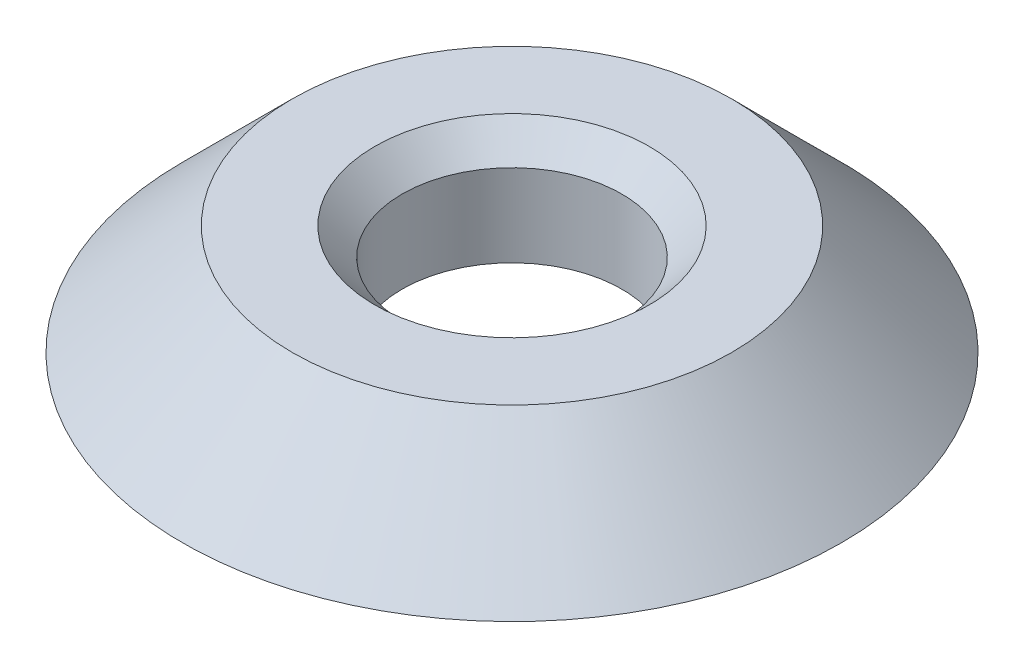
ISO-10303-21;
HEADER;
FILE_DESCRIPTION(('STEP AP214'),'2;1');
FILE_NAME('part.step','',(''),(''),'','','');
FILE_SCHEMA(('AUTOMOTIVE_DESIGN { 1 0 10303 214 1 1 1 1 }'));
ENDSEC;
DATA;
#1=APPLICATION_CONTEXT('core data for automotive mechanical design processes');
#2=APPLICATION_PROTOCOL_DEFINITION('international standard','automotive_design',2000,#1);
#3=PRODUCT_CONTEXT('',#1,'mechanical');
#4=PRODUCT('Part','Part','',(#3));
#5=PRODUCT_RELATED_PRODUCT_CATEGORY('part','',(#4));
#6=PRODUCT_DEFINITION_FORMATION('','',#4);
#7=PRODUCT_DEFINITION_CONTEXT('part definition',#1,'design');
#8=PRODUCT_DEFINITION('design','',#6,#7);
#9=PRODUCT_DEFINITION_SHAPE('','',#8);
#10=(LENGTH_UNIT() NAMED_UNIT(*) SI_UNIT(.MILLI.,.METRE.));
#11=(NAMED_UNIT(*) PLANE_ANGLE_UNIT() SI_UNIT($,.RADIAN.));
#12=(NAMED_UNIT(*) SI_UNIT($,.STERADIAN.) SOLID_ANGLE_UNIT());
#13=UNCERTAINTY_MEASURE_WITH_UNIT(LENGTH_MEASURE(1.E-05),#10,'distance_accuracy_value','');
#14=(GEOMETRIC_REPRESENTATION_CONTEXT(3) GLOBAL_UNCERTAINTY_ASSIGNED_CONTEXT((#13)) GLOBAL_UNIT_ASSIGNED_CONTEXT((#10,
#11,#12)) REPRESENTATION_CONTEXT('',''));
#15=CARTESIAN_POINT('',(0.,0.,0.));
#16=DIRECTION('',(0.,0.,1.));
#17=DIRECTION('',(1.,0.,0.));
#18=AXIS2_PLACEMENT_3D('',#15,#16,#17);
#19=CARTESIAN_POINT('',(6.,0.,0.));
#20=DIRECTION('',(0.,-1.,0.));
#21=DIRECTION('',(1.,0.,0.));
#22=AXIS2_PLACEMENT_3D('',#19,#20,#21);
#23=PLANE('',#22);
#24=CARTESIAN_POINT('',(0.,0.,0.));
#25=DIRECTION('',(0.,-1.,0.));
#26=DIRECTION('',(1.,0.,0.));
#27=AXIS2_PLACEMENT_3D('',#24,#25,#26);
#28=CIRCLE('',#27,6.);
#29=CARTESIAN_POINT('',(6.,0.,0.));
#30=VERTEX_POINT('',#29);
#31=EDGE_CURVE('E58',#30,#30,#28,.T.);
#32=ORIENTED_EDGE('',*,*,#31,.T.);
#33=EDGE_LOOP('',(#32));
#34=FACE_BOUND('',#33,.T.);
#35=CARTESIAN_POINT('',(0.,0.,0.));
#36=DIRECTION('',(0.,-1.,0.));
#37=DIRECTION('',(1.,0.,0.));
#38=AXIS2_PLACEMENT_3D('',#35,#36,#37);
#39=CIRCLE('',#38,2.);
#40=CARTESIAN_POINT('',(2.,0.,0.));
#41=VERTEX_POINT('',#40);
#42=EDGE_CURVE('E51',#41,#41,#39,.T.);
#43=ORIENTED_EDGE('',*,*,#42,.F.);
#44=EDGE_LOOP('',(#43));
#45=FACE_BOUND('',#44,.T.);
#46=ADVANCED_FACE('F39',(#34,#45),#23,.T.);
#47=CARTESIAN_POINT('',(2.72954488913377E-12,-795.727916550779,0.));
#48=DIRECTION('',(0.,-1.,0.));
#49=DIRECTION('',(1.,0.,0.));
#50=AXIS2_PLACEMENT_3D('',#47,#48,#49);
#51=CYLINDRICAL_SURFACE('',#50,2.);
#52=CARTESIAN_POINT('',(0.,1.50000000000017,0.));
#53=DIRECTION('',(0.,1.,0.));
#54=DIRECTION('',(-1.,0.,0.));
#55=AXIS2_PLACEMENT_3D('',#52,#53,#54);
#56=CIRCLE('',#55,2.);
#57=CARTESIAN_POINT('',(-2.00000000000001,1.50000000000016,0.));
#58=VERTEX_POINT('',#57);
#59=EDGE_CURVE('E10',#58,#58,#56,.T.);
#60=ORIENTED_EDGE('',*,*,#59,.T.);
#61=EDGE_LOOP('',(#60));
#62=FACE_BOUND('',#61,.T.);
#63=ORIENTED_EDGE('',*,*,#42,.T.);
#64=EDGE_LOOP('',(#63));
#65=FACE_BOUND('',#64,.T.);
#66=ADVANCED_FACE('F80',(#62,#65),#51,.F.);
#67=CARTESIAN_POINT('',(2.,2.,0.));
#68=DIRECTION('',(0.,1.,0.));
#69=DIRECTION('',(-1.,0.,0.));
#70=AXIS2_PLACEMENT_3D('',#67,#68,#69);
#71=PLANE('',#70);
#72=CARTESIAN_POINT('',(0.,1.99999999999999,0.));
#73=DIRECTION('',(0.,1.,0.));
#74=DIRECTION('',(-1.,0.,0.));
#75=AXIS2_PLACEMENT_3D('',#72,#73,#74);
#76=CIRCLE('',#75,2.49999999999982);
#77=CARTESIAN_POINT('',(-2.49999999999983,1.99999999999998,0.));
#78=VERTEX_POINT('',#77);
#79=EDGE_CURVE('E50',#78,#78,#76,.F.);
#80=ORIENTED_EDGE('',*,*,#79,.T.);
#81=EDGE_LOOP('',(#80));
#82=FACE_BOUND('',#81,.T.);
#83=CARTESIAN_POINT('',(0.,2.,0.));
#84=DIRECTION('',(0.,-1.,0.));
#85=DIRECTION('',(1.,0.,0.));
#86=AXIS2_PLACEMENT_3D('',#83,#84,#85);
#87=CIRCLE('',#86,4.00000000000001);
#88=CARTESIAN_POINT('',(4.,2.00000000000002,0.));
#89=VERTEX_POINT('',#88);
#90=EDGE_CURVE('E54',#89,#89,#87,.T.);
#91=ORIENTED_EDGE('',*,*,#90,.F.);
#92=EDGE_LOOP('',(#91));
#93=FACE_BOUND('',#92,.T.);
#94=ADVANCED_FACE('F70',(#82,#93),#71,.T.);
#95=CARTESIAN_POINT('',(0.,0.,0.));
#96=DIRECTION('',(0.,-1.,0.));
#97=DIRECTION('',(1.,0.,0.));
#98=AXIS2_PLACEMENT_3D('',#95,#96,#97);
#99=CONICAL_SURFACE('',#98,6.,0.785398163397446);
#100=ORIENTED_EDGE('',*,*,#90,.T.);
#101=EDGE_LOOP('',(#100));
#102=FACE_BOUND('',#101,.T.);
#103=ORIENTED_EDGE('',*,*,#31,.F.);
#104=EDGE_LOOP('',(#103));
#105=FACE_BOUND('',#104,.T.);
#106=ADVANCED_FACE('F67',(#102,#105),#99,.T.);
#107=CARTESIAN_POINT('',(0.,2.,0.));
#108=DIRECTION('',(0.,1.,0.));
#109=DIRECTION('',(-1.,0.,0.));
#110=AXIS2_PLACEMENT_3D('',#107,#108,#109);
#111=CONICAL_SURFACE('',#110,2.49999999999984,0.785398163397447);
#112=ORIENTED_EDGE('',*,*,#59,.F.);
#113=EDGE_LOOP('',(#112));
#114=FACE_BOUND('',#113,.T.);
#115=ORIENTED_EDGE('',*,*,#79,.F.);
#116=EDGE_LOOP('',(#115));
#117=FACE_BOUND('',#116,.T.);
#118=ADVANCED_FACE('F45',(#114,#117),#111,.F.);
#119=CLOSED_SHELL('',(#46,#66,#94,#106,#118));
#120=MANIFOLD_SOLID_BREP('B2',#119);
#121=ADVANCED_BREP_SHAPE_REPRESENTATION('',(#18,#120),#14);
#122=SHAPE_DEFINITION_REPRESENTATION(#9,#121);
ENDSEC;
END-ISO-10303-21;
